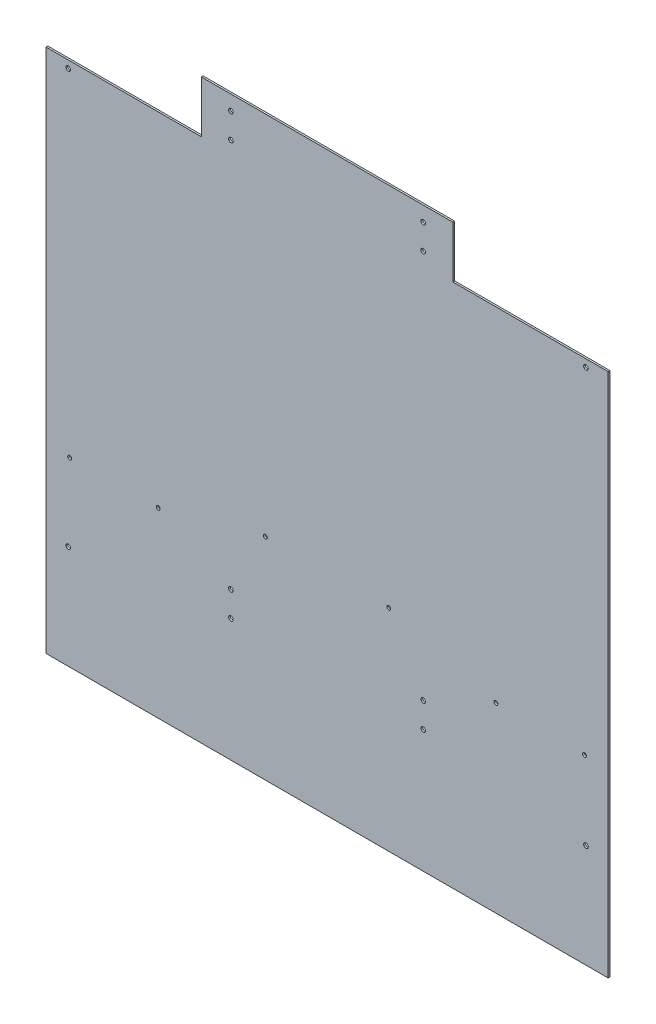
ISO-10303-21;
HEADER;
FILE_DESCRIPTION(('STEP AP214'),'2;1');
FILE_NAME('part.step','',(''),(''),'','','');
FILE_SCHEMA(('AUTOMOTIVE_DESIGN { 1 0 10303 214 1 1 1 1 }'));
ENDSEC;
DATA;
#1=APPLICATION_CONTEXT('core data for automotive mechanical design processes');
#2=APPLICATION_PROTOCOL_DEFINITION('international standard','automotive_design',2000,#1);
#3=PRODUCT_CONTEXT('',#1,'mechanical');
#4=PRODUCT('Part','Part','',(#3));
#5=PRODUCT_RELATED_PRODUCT_CATEGORY('part','',(#4));
#6=PRODUCT_DEFINITION_FORMATION('','',#4);
#7=PRODUCT_DEFINITION_CONTEXT('part definition',#1,'design');
#8=PRODUCT_DEFINITION('design','',#6,#7);
#9=PRODUCT_DEFINITION_SHAPE('','',#8);
#10=(LENGTH_UNIT() NAMED_UNIT(*) SI_UNIT(.MILLI.,.METRE.));
#11=(NAMED_UNIT(*) PLANE_ANGLE_UNIT() SI_UNIT($,.RADIAN.));
#12=(NAMED_UNIT(*) SI_UNIT($,.STERADIAN.) SOLID_ANGLE_UNIT());
#13=UNCERTAINTY_MEASURE_WITH_UNIT(LENGTH_MEASURE(1.E-05),#10,'distance_accuracy_value','');
#14=(GEOMETRIC_REPRESENTATION_CONTEXT(3) GLOBAL_UNCERTAINTY_ASSIGNED_CONTEXT((#13)) GLOBAL_UNIT_ASSIGNED_CONTEXT((#10,
#11,#12)) REPRESENTATION_CONTEXT('',''));
#15=CARTESIAN_POINT('',(0.,0.,0.));
#16=DIRECTION('',(0.,0.,1.));
#17=DIRECTION('',(1.,0.,0.));
#18=AXIS2_PLACEMENT_3D('',#15,#16,#17);
#19=CARTESIAN_POINT('',(0.,0.,0.));
#20=DIRECTION('',(0.,0.,-1.));
#21=DIRECTION('',(-1.,0.,0.));
#22=AXIS2_PLACEMENT_3D('',#19,#20,#21);
#23=PLANE('',#22);
#24=CARTESIAN_POINT('',(-165.1,922.02,0.));
#25=DIRECTION('',(0.,0.,1.));
#26=DIRECTION('',(1.,0.,0.));
#27=AXIS2_PLACEMENT_3D('',#24,#25,#26);
#28=CIRCLE('',#27,3.96874999999999);
#29=CARTESIAN_POINT('',(-161.13125,922.02,0.));
#30=VERTEX_POINT('',#29);
#31=EDGE_CURVE('E282',#30,#30,#28,.T.);
#32=ORIENTED_EDGE('',*,*,#31,.T.);
#33=EDGE_LOOP('',(#32));
#34=FACE_BOUND('',#33,.T.);
#35=CARTESIAN_POINT('',(-165.1,965.2,0.));
#36=DIRECTION('',(0.,0.,1.));
#37=DIRECTION('',(1.,0.,0.));
#38=AXIS2_PLACEMENT_3D('',#35,#36,#37);
#39=CIRCLE('',#38,3.96874999999999);
#40=CARTESIAN_POINT('',(-161.13125,965.2,0.));
#41=VERTEX_POINT('',#40);
#42=EDGE_CURVE('E276',#41,#41,#39,.T.);
#43=ORIENTED_EDGE('',*,*,#42,.T.);
#44=EDGE_LOOP('',(#43));
#45=FACE_BOUND('',#44,.T.);
#46=CARTESIAN_POINT('',(165.099999999979,965.2,0.));
#47=DIRECTION('',(0.,0.,1.));
#48=DIRECTION('',(1.,0.,0.));
#49=AXIS2_PLACEMENT_3D('',#46,#47,#48);
#50=CIRCLE('',#49,3.96874999999999);
#51=CARTESIAN_POINT('',(169.068749999979,965.2,0.));
#52=VERTEX_POINT('',#51);
#53=EDGE_CURVE('E270',#52,#52,#50,.T.);
#54=ORIENTED_EDGE('',*,*,#53,.T.);
#55=EDGE_LOOP('',(#54));
#56=FACE_BOUND('',#55,.T.);
#57=CARTESIAN_POINT('',(165.099999999979,922.02,0.));
#58=DIRECTION('',(0.,0.,1.));
#59=DIRECTION('',(1.,0.,0.));
#60=AXIS2_PLACEMENT_3D('',#57,#58,#59);
#61=CIRCLE('',#60,3.96874999999999);
#62=CARTESIAN_POINT('',(169.068749999979,922.02,0.));
#63=VERTEX_POINT('',#62);
#64=EDGE_CURVE('E264',#63,#63,#61,.T.);
#65=ORIENTED_EDGE('',*,*,#64,.T.);
#66=EDGE_LOOP('',(#65));
#67=FACE_BOUND('',#66,.T.);
#68=CARTESIAN_POINT('',(-165.099999999993,210.82,0.));
#69=DIRECTION('',(0.,0.,1.));
#70=DIRECTION('',(1.,0.,0.));
#71=AXIS2_PLACEMENT_3D('',#68,#69,#70);
#72=CIRCLE('',#71,3.96874999999999);
#73=CARTESIAN_POINT('',(-161.131249999993,210.82,0.));
#74=VERTEX_POINT('',#73);
#75=EDGE_CURVE('E258',#74,#74,#72,.T.);
#76=ORIENTED_EDGE('',*,*,#75,.T.);
#77=EDGE_LOOP('',(#76));
#78=FACE_BOUND('',#77,.T.);
#79=CARTESIAN_POINT('',(-165.099999999993,254.,0.));
#80=DIRECTION('',(0.,0.,1.));
#81=DIRECTION('',(1.,0.,0.));
#82=AXIS2_PLACEMENT_3D('',#79,#80,#81);
#83=CIRCLE('',#82,3.96874999999999);
#84=CARTESIAN_POINT('',(-161.131249999993,254.,0.));
#85=VERTEX_POINT('',#84);
#86=EDGE_CURVE('E252',#85,#85,#83,.T.);
#87=ORIENTED_EDGE('',*,*,#86,.T.);
#88=EDGE_LOOP('',(#87));
#89=FACE_BOUND('',#88,.T.);
#90=CARTESIAN_POINT('',(165.099999999987,254.,0.));
#91=DIRECTION('',(0.,0.,1.));
#92=DIRECTION('',(1.,0.,0.));
#93=AXIS2_PLACEMENT_3D('',#90,#91,#92);
#94=CIRCLE('',#93,3.96874999999999);
#95=CARTESIAN_POINT('',(169.068749999987,254.,0.));
#96=VERTEX_POINT('',#95);
#97=EDGE_CURVE('E246',#96,#96,#94,.T.);
#98=ORIENTED_EDGE('',*,*,#97,.T.);
#99=EDGE_LOOP('',(#98));
#100=FACE_BOUND('',#99,.T.);
#101=DIRECTION('',(0.,-1.,0.));
#102=VECTOR('',#101,1.);
#103=CARTESIAN_POINT('',(-482.6,0.,0.));
#104=LINE('',#103,#102);
#105=CARTESIAN_POINT('',(-482.6,901.7,0.));
#106=VERTEX_POINT('',#105);
#107=CARTESIAN_POINT('',(-482.6,0.,0.));
#108=VERTEX_POINT('',#107);
#109=EDGE_CURVE('E133',#106,#108,#104,.T.);
#110=ORIENTED_EDGE('',*,*,#109,.F.);
#111=DIRECTION('',(-1.,0.,0.));
#112=VECTOR('',#111,1.);
#113=CARTESIAN_POINT('',(-482.6,901.7,0.));
#114=LINE('',#113,#112);
#115=CARTESIAN_POINT('',(-215.9,901.7,0.));
#116=VERTEX_POINT('',#115);
#117=EDGE_CURVE('E87',#116,#106,#114,.T.);
#118=ORIENTED_EDGE('',*,*,#117,.F.);
#119=DIRECTION('',(0.,-1.,0.));
#120=VECTOR('',#119,1.);
#121=CARTESIAN_POINT('',(-215.9,901.7,0.));
#122=LINE('',#121,#120);
#123=CARTESIAN_POINT('',(-215.9,990.6,0.));
#124=VERTEX_POINT('',#123);
#125=EDGE_CURVE('E81',#124,#116,#122,.T.);
#126=ORIENTED_EDGE('',*,*,#125,.F.);
#127=DIRECTION('',(-1.,0.,0.));
#128=VECTOR('',#127,1.);
#129=CARTESIAN_POINT('',(-215.9,990.6,0.));
#130=LINE('',#129,#128);
#131=CARTESIAN_POINT('',(215.9,990.6,0.));
#132=VERTEX_POINT('',#131);
#133=EDGE_CURVE('E123',#132,#124,#130,.T.);
#134=ORIENTED_EDGE('',*,*,#133,.F.);
#135=DIRECTION('',(0.,1.,0.));
#136=VECTOR('',#135,1.);
#137=CARTESIAN_POINT('',(215.9,990.6,0.));
#138=LINE('',#137,#136);
#139=CARTESIAN_POINT('',(215.9,901.7,0.));
#140=VERTEX_POINT('',#139);
#141=EDGE_CURVE('E143',#140,#132,#138,.T.);
#142=ORIENTED_EDGE('',*,*,#141,.F.);
#143=DIRECTION('',(-1.,0.,0.));
#144=VECTOR('',#143,1.);
#145=CARTESIAN_POINT('',(215.9,901.7,0.));
#146=LINE('',#145,#144);
#147=CARTESIAN_POINT('',(482.6,901.7,0.));
#148=VERTEX_POINT('',#147);
#149=EDGE_CURVE('E141',#148,#140,#146,.T.);
#150=ORIENTED_EDGE('',*,*,#149,.F.);
#151=DIRECTION('',(0.,1.,0.));
#152=VECTOR('',#151,1.);
#153=CARTESIAN_POINT('',(482.6,0.,0.));
#154=LINE('',#153,#152);
#155=CARTESIAN_POINT('',(482.6,0.,0.));
#156=VERTEX_POINT('',#155);
#157=EDGE_CURVE('E139',#156,#148,#154,.T.);
#158=ORIENTED_EDGE('',*,*,#157,.F.);
#159=DIRECTION('',(1.,0.,0.));
#160=VECTOR('',#159,1.);
#161=CARTESIAN_POINT('',(-482.6,0.,0.));
#162=LINE('',#161,#160);
#163=EDGE_CURVE('E136',#108,#156,#162,.T.);
#164=ORIENTED_EDGE('',*,*,#163,.F.);
#165=EDGE_LOOP('',(#110,#118,#126,#134,#142,#150,#158,#164));
#166=FACE_BOUND('',#165,.T.);
#167=CARTESIAN_POINT('',(-441.96,311.509186149953,0.));
#168=DIRECTION('',(0.,0.,1.));
#169=DIRECTION('',(1.,0.,0.));
#170=AXIS2_PLACEMENT_3D('',#167,#168,#169);
#171=CIRCLE('',#170,3.3782);
#172=CARTESIAN_POINT('',(-438.5818,311.509186149953,0.));
#173=VERTEX_POINT('',#172);
#174=EDGE_CURVE('E137',#173,#173,#171,.T.);
#175=ORIENTED_EDGE('',*,*,#174,.T.);
#176=EDGE_LOOP('',(#175));
#177=FACE_BOUND('',#176,.T.);
#178=CARTESIAN_POINT('',(441.96,311.509186149953,0.));
#179=DIRECTION('',(0.,0.,1.));
#180=DIRECTION('',(1.,0.,0.));
#181=AXIS2_PLACEMENT_3D('',#178,#179,#180);
#182=CIRCLE('',#181,3.3782);
#183=CARTESIAN_POINT('',(445.3382,311.509186149953,0.));
#184=VERTEX_POINT('',#183);
#185=EDGE_CURVE('E186',#184,#184,#182,.T.);
#186=ORIENTED_EDGE('',*,*,#185,.T.);
#187=EDGE_LOOP('',(#186));
#188=FACE_BOUND('',#187,.T.);
#189=CARTESIAN_POINT('',(-105.907561141766,362.110143282902,0.));
#190=DIRECTION('',(0.,0.,1.));
#191=DIRECTION('',(1.,0.,0.));
#192=AXIS2_PLACEMENT_3D('',#189,#190,#191);
#193=CIRCLE('',#192,3.3782);
#194=CARTESIAN_POINT('',(-102.529361141766,362.110143282902,0.));
#195=VERTEX_POINT('',#194);
#196=EDGE_CURVE('E192',#195,#195,#193,.T.);
#197=ORIENTED_EDGE('',*,*,#196,.T.);
#198=EDGE_LOOP('',(#197));
#199=FACE_BOUND('',#198,.T.);
#200=CARTESIAN_POINT('',(-289.916431049834,312.805115190872,0.));
#201=DIRECTION('',(0.,0.,1.));
#202=DIRECTION('',(1.,0.,0.));
#203=AXIS2_PLACEMENT_3D('',#200,#201,#202);
#204=CIRCLE('',#203,3.3782);
#205=CARTESIAN_POINT('',(-286.538231049834,312.805115190872,0.));
#206=VERTEX_POINT('',#205);
#207=EDGE_CURVE('E198',#206,#206,#204,.T.);
#208=ORIENTED_EDGE('',*,*,#207,.T.);
#209=EDGE_LOOP('',(#208));
#210=FACE_BOUND('',#209,.T.);
#211=CARTESIAN_POINT('',(289.916431049834,312.805115190872,0.));
#212=DIRECTION('',(0.,0.,1.));
#213=DIRECTION('',(1.,0.,0.));
#214=AXIS2_PLACEMENT_3D('',#211,#212,#213);
#215=CIRCLE('',#214,3.3782);
#216=CARTESIAN_POINT('',(293.294631049834,312.805115190872,0.));
#217=VERTEX_POINT('',#216);
#218=EDGE_CURVE('E204',#217,#217,#215,.T.);
#219=ORIENTED_EDGE('',*,*,#218,.T.);
#220=EDGE_LOOP('',(#219));
#221=FACE_BOUND('',#220,.T.);
#222=CARTESIAN_POINT('',(105.907561141766,362.110143282902,0.));
#223=DIRECTION('',(0.,0.,1.));
#224=DIRECTION('',(1.,0.,0.));
#225=AXIS2_PLACEMENT_3D('',#222,#223,#224);
#226=CIRCLE('',#225,3.3782);
#227=CARTESIAN_POINT('',(109.285761141766,362.110143282902,0.));
#228=VERTEX_POINT('',#227);
#229=EDGE_CURVE('E210',#228,#228,#226,.T.);
#230=ORIENTED_EDGE('',*,*,#229,.T.);
#231=EDGE_LOOP('',(#230));
#232=FACE_BOUND('',#231,.T.);
#233=CARTESIAN_POINT('',(444.499999999977,889.,0.));
#234=DIRECTION('',(0.,0.,1.));
#235=DIRECTION('',(1.,0.,0.));
#236=AXIS2_PLACEMENT_3D('',#233,#234,#235);
#237=CIRCLE('',#236,3.96875000000002);
#238=CARTESIAN_POINT('',(448.468749999977,889.,0.));
#239=VERTEX_POINT('',#238);
#240=EDGE_CURVE('E216',#239,#239,#237,.T.);
#241=ORIENTED_EDGE('',*,*,#240,.T.);
#242=EDGE_LOOP('',(#241));
#243=FACE_BOUND('',#242,.T.);
#244=CARTESIAN_POINT('',(-444.500000000002,889.,0.));
#245=DIRECTION('',(0.,0.,1.));
#246=DIRECTION('',(1.,0.,0.));
#247=AXIS2_PLACEMENT_3D('',#244,#245,#246);
#248=CIRCLE('',#247,3.96875000000002);
#249=CARTESIAN_POINT('',(-440.531250000002,889.,0.));
#250=VERTEX_POINT('',#249);
#251=EDGE_CURVE('E222',#250,#250,#248,.T.);
#252=ORIENTED_EDGE('',*,*,#251,.T.);
#253=EDGE_LOOP('',(#252));
#254=FACE_BOUND('',#253,.T.);
#255=CARTESIAN_POINT('',(444.499999999979,177.8,0.));
#256=DIRECTION('',(0.,0.,1.));
#257=DIRECTION('',(1.,0.,0.));
#258=AXIS2_PLACEMENT_3D('',#255,#256,#257);
#259=CIRCLE('',#258,3.96875000000002);
#260=CARTESIAN_POINT('',(448.468749999979,177.8,0.));
#261=VERTEX_POINT('',#260);
#262=EDGE_CURVE('E228',#261,#261,#259,.T.);
#263=ORIENTED_EDGE('',*,*,#262,.T.);
#264=EDGE_LOOP('',(#263));
#265=FACE_BOUND('',#264,.T.);
#266=CARTESIAN_POINT('',(-444.5,177.8,0.));
#267=DIRECTION('',(0.,0.,1.));
#268=DIRECTION('',(1.,0.,0.));
#269=AXIS2_PLACEMENT_3D('',#266,#267,#268);
#270=CIRCLE('',#269,3.96875000000002);
#271=CARTESIAN_POINT('',(-440.53125,177.8,0.));
#272=VERTEX_POINT('',#271);
#273=EDGE_CURVE('E234',#272,#272,#270,.T.);
#274=ORIENTED_EDGE('',*,*,#273,.T.);
#275=EDGE_LOOP('',(#274));
#276=FACE_BOUND('',#275,.T.);
#277=CARTESIAN_POINT('',(165.099999999987,210.82,0.));
#278=DIRECTION('',(0.,0.,1.));
#279=DIRECTION('',(1.,0.,0.));
#280=AXIS2_PLACEMENT_3D('',#277,#278,#279);
#281=CIRCLE('',#280,3.96874999999999);
#282=CARTESIAN_POINT('',(169.068749999987,210.82,0.));
#283=VERTEX_POINT('',#282);
#284=EDGE_CURVE('E240',#283,#283,#281,.T.);
#285=ORIENTED_EDGE('',*,*,#284,.T.);
#286=EDGE_LOOP('',(#285));
#287=FACE_BOUND('',#286,.T.);
#288=ADVANCED_FACE('F35',(#34,#45,#56,#67,#78,#89,#100,#166,#177,#188,#199,#210,#221,#232,#243,
#254,#265,#276,#287),#23,.T.);
#289=CARTESIAN_POINT('',(0.,0.,3.175));
#290=DIRECTION('',(0.,0.,-1.));
#291=DIRECTION('',(-1.,0.,0.));
#292=AXIS2_PLACEMENT_3D('',#289,#290,#291);
#293=PLANE('',#292);
#294=CARTESIAN_POINT('',(-165.1,922.02,3.175));
#295=DIRECTION('',(0.,0.,1.));
#296=DIRECTION('',(1.,0.,0.));
#297=AXIS2_PLACEMENT_3D('',#294,#295,#296);
#298=CIRCLE('',#297,3.96874999999999);
#299=CARTESIAN_POINT('',(-161.13125,922.02,3.175));
#300=VERTEX_POINT('',#299);
#301=EDGE_CURVE('E285',#300,#300,#298,.T.);
#302=ORIENTED_EDGE('',*,*,#301,.F.);
#303=EDGE_LOOP('',(#302));
#304=FACE_BOUND('',#303,.T.);
#305=CARTESIAN_POINT('',(-165.1,965.2,3.175));
#306=DIRECTION('',(0.,0.,1.));
#307=DIRECTION('',(1.,0.,0.));
#308=AXIS2_PLACEMENT_3D('',#305,#306,#307);
#309=CIRCLE('',#308,3.96874999999999);
#310=CARTESIAN_POINT('',(-161.13125,965.2,3.175));
#311=VERTEX_POINT('',#310);
#312=EDGE_CURVE('E279',#311,#311,#309,.T.);
#313=ORIENTED_EDGE('',*,*,#312,.F.);
#314=EDGE_LOOP('',(#313));
#315=FACE_BOUND('',#314,.T.);
#316=CARTESIAN_POINT('',(165.099999999979,965.2,3.175));
#317=DIRECTION('',(0.,0.,1.));
#318=DIRECTION('',(1.,0.,0.));
#319=AXIS2_PLACEMENT_3D('',#316,#317,#318);
#320=CIRCLE('',#319,3.96874999999999);
#321=CARTESIAN_POINT('',(169.068749999979,965.2,3.175));
#322=VERTEX_POINT('',#321);
#323=EDGE_CURVE('E273',#322,#322,#320,.T.);
#324=ORIENTED_EDGE('',*,*,#323,.F.);
#325=EDGE_LOOP('',(#324));
#326=FACE_BOUND('',#325,.T.);
#327=CARTESIAN_POINT('',(165.099999999979,922.02,3.175));
#328=DIRECTION('',(0.,0.,1.));
#329=DIRECTION('',(1.,0.,0.));
#330=AXIS2_PLACEMENT_3D('',#327,#328,#329);
#331=CIRCLE('',#330,3.96874999999999);
#332=CARTESIAN_POINT('',(169.068749999979,922.02,3.175));
#333=VERTEX_POINT('',#332);
#334=EDGE_CURVE('E267',#333,#333,#331,.T.);
#335=ORIENTED_EDGE('',*,*,#334,.F.);
#336=EDGE_LOOP('',(#335));
#337=FACE_BOUND('',#336,.T.);
#338=CARTESIAN_POINT('',(-165.099999999993,210.82,3.175));
#339=DIRECTION('',(0.,0.,1.));
#340=DIRECTION('',(1.,0.,0.));
#341=AXIS2_PLACEMENT_3D('',#338,#339,#340);
#342=CIRCLE('',#341,3.96874999999999);
#343=CARTESIAN_POINT('',(-161.131249999993,210.82,3.175));
#344=VERTEX_POINT('',#343);
#345=EDGE_CURVE('E261',#344,#344,#342,.T.);
#346=ORIENTED_EDGE('',*,*,#345,.F.);
#347=EDGE_LOOP('',(#346));
#348=FACE_BOUND('',#347,.T.);
#349=CARTESIAN_POINT('',(-165.099999999993,254.,3.175));
#350=DIRECTION('',(0.,0.,1.));
#351=DIRECTION('',(1.,0.,0.));
#352=AXIS2_PLACEMENT_3D('',#349,#350,#351);
#353=CIRCLE('',#352,3.96874999999999);
#354=CARTESIAN_POINT('',(-161.131249999993,254.,3.175));
#355=VERTEX_POINT('',#354);
#356=EDGE_CURVE('E255',#355,#355,#353,.T.);
#357=ORIENTED_EDGE('',*,*,#356,.F.);
#358=EDGE_LOOP('',(#357));
#359=FACE_BOUND('',#358,.T.);
#360=CARTESIAN_POINT('',(165.099999999987,254.,3.175));
#361=DIRECTION('',(0.,0.,1.));
#362=DIRECTION('',(1.,0.,0.));
#363=AXIS2_PLACEMENT_3D('',#360,#361,#362);
#364=CIRCLE('',#363,3.96874999999999);
#365=CARTESIAN_POINT('',(169.068749999987,254.,3.175));
#366=VERTEX_POINT('',#365);
#367=EDGE_CURVE('E249',#366,#366,#364,.T.);
#368=ORIENTED_EDGE('',*,*,#367,.F.);
#369=EDGE_LOOP('',(#368));
#370=FACE_BOUND('',#369,.T.);
#371=CARTESIAN_POINT('',(165.099999999987,210.82,3.175));
#372=DIRECTION('',(0.,0.,1.));
#373=DIRECTION('',(1.,0.,0.));
#374=AXIS2_PLACEMENT_3D('',#371,#372,#373);
#375=CIRCLE('',#374,3.96874999999999);
#376=CARTESIAN_POINT('',(169.068749999987,210.82,3.175));
#377=VERTEX_POINT('',#376);
#378=EDGE_CURVE('E243',#377,#377,#375,.T.);
#379=ORIENTED_EDGE('',*,*,#378,.F.);
#380=EDGE_LOOP('',(#379));
#381=FACE_BOUND('',#380,.T.);
#382=CARTESIAN_POINT('',(-444.5,177.8,3.175));
#383=DIRECTION('',(0.,0.,1.));
#384=DIRECTION('',(1.,0.,0.));
#385=AXIS2_PLACEMENT_3D('',#382,#383,#384);
#386=CIRCLE('',#385,3.96875000000002);
#387=CARTESIAN_POINT('',(-440.53125,177.8,3.175));
#388=VERTEX_POINT('',#387);
#389=EDGE_CURVE('E237',#388,#388,#386,.T.);
#390=ORIENTED_EDGE('',*,*,#389,.F.);
#391=EDGE_LOOP('',(#390));
#392=FACE_BOUND('',#391,.T.);
#393=CARTESIAN_POINT('',(444.499999999979,177.8,3.175));
#394=DIRECTION('',(0.,0.,1.));
#395=DIRECTION('',(1.,0.,0.));
#396=AXIS2_PLACEMENT_3D('',#393,#394,#395);
#397=CIRCLE('',#396,3.96875000000002);
#398=CARTESIAN_POINT('',(448.468749999979,177.8,3.175));
#399=VERTEX_POINT('',#398);
#400=EDGE_CURVE('E231',#399,#399,#397,.T.);
#401=ORIENTED_EDGE('',*,*,#400,.F.);
#402=EDGE_LOOP('',(#401));
#403=FACE_BOUND('',#402,.T.);
#404=CARTESIAN_POINT('',(444.499999999977,889.,3.175));
#405=DIRECTION('',(0.,0.,1.));
#406=DIRECTION('',(1.,0.,0.));
#407=AXIS2_PLACEMENT_3D('',#404,#405,#406);
#408=CIRCLE('',#407,3.96875000000002);
#409=CARTESIAN_POINT('',(448.468749999977,889.,3.175));
#410=VERTEX_POINT('',#409);
#411=EDGE_CURVE('E219',#410,#410,#408,.T.);
#412=ORIENTED_EDGE('',*,*,#411,.F.);
#413=EDGE_LOOP('',(#412));
#414=FACE_BOUND('',#413,.T.);
#415=CARTESIAN_POINT('',(105.907561141766,362.110143282902,3.175));
#416=DIRECTION('',(0.,0.,1.));
#417=DIRECTION('',(1.,0.,0.));
#418=AXIS2_PLACEMENT_3D('',#415,#416,#417);
#419=CIRCLE('',#418,3.37819999999998);
#420=CARTESIAN_POINT('',(109.285761141766,362.110143282902,3.175));
#421=VERTEX_POINT('',#420);
#422=EDGE_CURVE('E213',#421,#421,#419,.T.);
#423=ORIENTED_EDGE('',*,*,#422,.F.);
#424=EDGE_LOOP('',(#423));
#425=FACE_BOUND('',#424,.T.);
#426=CARTESIAN_POINT('',(289.916431049834,312.805115190872,3.175));
#427=DIRECTION('',(0.,0.,1.));
#428=DIRECTION('',(1.,0.,0.));
#429=AXIS2_PLACEMENT_3D('',#426,#427,#428);
#430=CIRCLE('',#429,3.3782);
#431=CARTESIAN_POINT('',(293.294631049834,312.805115190872,3.175));
#432=VERTEX_POINT('',#431);
#433=EDGE_CURVE('E207',#432,#432,#430,.T.);
#434=ORIENTED_EDGE('',*,*,#433,.F.);
#435=EDGE_LOOP('',(#434));
#436=FACE_BOUND('',#435,.T.);
#437=CARTESIAN_POINT('',(-289.916431049834,312.805115190872,3.175));
#438=DIRECTION('',(0.,0.,1.));
#439=DIRECTION('',(1.,0.,0.));
#440=AXIS2_PLACEMENT_3D('',#437,#438,#439);
#441=CIRCLE('',#440,3.3782);
#442=CARTESIAN_POINT('',(-286.538231049834,312.805115190872,3.175));
#443=VERTEX_POINT('',#442);
#444=EDGE_CURVE('E201',#443,#443,#441,.T.);
#445=ORIENTED_EDGE('',*,*,#444,.F.);
#446=EDGE_LOOP('',(#445));
#447=FACE_BOUND('',#446,.T.);
#448=CARTESIAN_POINT('',(-105.907561141766,362.110143282902,3.175));
#449=DIRECTION('',(0.,0.,1.));
#450=DIRECTION('',(1.,0.,0.));
#451=AXIS2_PLACEMENT_3D('',#448,#449,#450);
#452=CIRCLE('',#451,3.37819999999998);
#453=CARTESIAN_POINT('',(-102.529361141766,362.110143282902,3.175));
#454=VERTEX_POINT('',#453);
#455=EDGE_CURVE('E195',#454,#454,#452,.T.);
#456=ORIENTED_EDGE('',*,*,#455,.F.);
#457=EDGE_LOOP('',(#456));
#458=FACE_BOUND('',#457,.T.);
#459=CARTESIAN_POINT('',(441.96,311.509186149953,3.175));
#460=DIRECTION('',(0.,0.,1.));
#461=DIRECTION('',(1.,0.,0.));
#462=AXIS2_PLACEMENT_3D('',#459,#460,#461);
#463=CIRCLE('',#462,3.3782);
#464=CARTESIAN_POINT('',(445.3382,311.509186149953,3.175));
#465=VERTEX_POINT('',#464);
#466=EDGE_CURVE('E189',#465,#465,#463,.T.);
#467=ORIENTED_EDGE('',*,*,#466,.F.);
#468=EDGE_LOOP('',(#467));
#469=FACE_BOUND('',#468,.T.);
#470=CARTESIAN_POINT('',(-441.96,311.509186149953,3.175));
#471=DIRECTION('',(0.,0.,1.));
#472=DIRECTION('',(1.,0.,0.));
#473=AXIS2_PLACEMENT_3D('',#470,#471,#472);
#474=CIRCLE('',#473,3.3782);
#475=CARTESIAN_POINT('',(-438.5818,311.509186149953,3.175));
#476=VERTEX_POINT('',#475);
#477=EDGE_CURVE('E183',#476,#476,#474,.T.);
#478=ORIENTED_EDGE('',*,*,#477,.F.);
#479=EDGE_LOOP('',(#478));
#480=FACE_BOUND('',#479,.T.);
#481=DIRECTION('',(0.,-1.,0.));
#482=VECTOR('',#481,1.);
#483=CARTESIAN_POINT('',(-482.6,0.,3.175));
#484=LINE('',#483,#482);
#485=CARTESIAN_POINT('',(-482.6,901.7,3.175));
#486=VERTEX_POINT('',#485);
#487=CARTESIAN_POINT('',(-482.6,0.,3.175));
#488=VERTEX_POINT('',#487);
#489=EDGE_CURVE('E148',#486,#488,#484,.T.);
#490=ORIENTED_EDGE('',*,*,#489,.T.);
#491=DIRECTION('',(1.,0.,0.));
#492=VECTOR('',#491,1.);
#493=CARTESIAN_POINT('',(-482.6,0.,3.175));
#494=LINE('',#493,#492);
#495=CARTESIAN_POINT('',(482.6,0.,3.175));
#496=VERTEX_POINT('',#495);
#497=EDGE_CURVE('E95',#488,#496,#494,.T.);
#498=ORIENTED_EDGE('',*,*,#497,.T.);
#499=DIRECTION('',(0.,1.,0.));
#500=VECTOR('',#499,1.);
#501=CARTESIAN_POINT('',(482.6,0.,3.175));
#502=LINE('',#501,#500);
#503=CARTESIAN_POINT('',(482.6,901.7,3.175));
#504=VERTEX_POINT('',#503);
#505=EDGE_CURVE('E163',#496,#504,#502,.T.);
#506=ORIENTED_EDGE('',*,*,#505,.T.);
#507=DIRECTION('',(-1.,0.,0.));
#508=VECTOR('',#507,1.);
#509=CARTESIAN_POINT('',(215.9,901.7,3.175));
#510=LINE('',#509,#508);
#511=CARTESIAN_POINT('',(215.9,901.7,3.175));
#512=VERTEX_POINT('',#511);
#513=EDGE_CURVE('E175',#504,#512,#510,.T.);
#514=ORIENTED_EDGE('',*,*,#513,.T.);
#515=DIRECTION('',(0.,1.,0.));
#516=VECTOR('',#515,1.);
#517=CARTESIAN_POINT('',(215.9,990.6,3.175));
#518=LINE('',#517,#516);
#519=CARTESIAN_POINT('',(215.9,990.6,3.175));
#520=VERTEX_POINT('',#519);
#521=EDGE_CURVE('E115',#512,#520,#518,.T.);
#522=ORIENTED_EDGE('',*,*,#521,.T.);
#523=DIRECTION('',(-1.,0.,0.));
#524=VECTOR('',#523,1.);
#525=CARTESIAN_POINT('',(-215.9,990.6,3.175));
#526=LINE('',#525,#524);
#527=CARTESIAN_POINT('',(-215.9,990.6,3.175));
#528=VERTEX_POINT('',#527);
#529=EDGE_CURVE('E108',#520,#528,#526,.T.);
#530=ORIENTED_EDGE('',*,*,#529,.T.);
#531=DIRECTION('',(0.,-1.,0.));
#532=VECTOR('',#531,1.);
#533=CARTESIAN_POINT('',(-215.9,901.7,3.175));
#534=LINE('',#533,#532);
#535=CARTESIAN_POINT('',(-215.9,901.7,3.175));
#536=VERTEX_POINT('',#535);
#537=EDGE_CURVE('E113',#528,#536,#534,.T.);
#538=ORIENTED_EDGE('',*,*,#537,.T.);
#539=DIRECTION('',(-1.,0.,0.));
#540=VECTOR('',#539,1.);
#541=CARTESIAN_POINT('',(-482.6,901.7,3.175));
#542=LINE('',#541,#540);
#543=EDGE_CURVE('E52',#536,#486,#542,.T.);
#544=ORIENTED_EDGE('',*,*,#543,.T.);
#545=EDGE_LOOP('',(#490,#498,#506,#514,#522,#530,#538,#544));
#546=FACE_BOUND('',#545,.T.);
#547=CARTESIAN_POINT('',(-444.500000000002,889.,3.175));
#548=DIRECTION('',(0.,0.,1.));
#549=DIRECTION('',(1.,0.,0.));
#550=AXIS2_PLACEMENT_3D('',#547,#548,#549);
#551=CIRCLE('',#550,3.96875000000002);
#552=CARTESIAN_POINT('',(-440.531250000002,889.,3.175));
#553=VERTEX_POINT('',#552);
#554=EDGE_CURVE('E225',#553,#553,#551,.T.);
#555=ORIENTED_EDGE('',*,*,#554,.F.);
#556=EDGE_LOOP('',(#555));
#557=FACE_BOUND('',#556,.T.);
#558=ADVANCED_FACE('F110',(#304,#315,#326,#337,#348,#359,#370,#381,#392,#403,#414,#425,#436,
#447,#458,#469,#480,#546,#557),#293,.F.);
#559=CARTESIAN_POINT('',(-482.6,0.,3.175));
#560=DIRECTION('',(1.,0.,0.));
#561=DIRECTION('',(0.,0.,-1.));
#562=AXIS2_PLACEMENT_3D('',#559,#560,#561);
#563=PLANE('',#562);
#564=ORIENTED_EDGE('',*,*,#109,.T.);
#565=DIRECTION('',(0.,0.,-1.));
#566=VECTOR('',#565,1.);
#567=CARTESIAN_POINT('',(-482.6,0.,3.175));
#568=LINE('',#567,#566);
#569=EDGE_CURVE('E11',#488,#108,#568,.T.);
#570=ORIENTED_EDGE('',*,*,#569,.F.);
#571=ORIENTED_EDGE('',*,*,#489,.F.);
#572=DIRECTION('',(0.,0.,-1.));
#573=VECTOR('',#572,1.);
#574=CARTESIAN_POINT('',(-482.6,901.7,3.175));
#575=LINE('',#574,#573);
#576=EDGE_CURVE('E129',#486,#106,#575,.T.);
#577=ORIENTED_EDGE('',*,*,#576,.T.);
#578=EDGE_LOOP('',(#564,#570,#571,#577));
#579=FACE_BOUND('',#578,.T.);
#580=ADVANCED_FACE('F37',(#579),#563,.F.);
#581=CARTESIAN_POINT('',(-482.6,0.,3.175));
#582=DIRECTION('',(0.,1.,0.));
#583=DIRECTION('',(0.,0.,1.));
#584=AXIS2_PLACEMENT_3D('',#581,#582,#583);
#585=PLANE('',#584);
#586=ORIENTED_EDGE('',*,*,#163,.T.);
#587=DIRECTION('',(0.,0.,-1.));
#588=VECTOR('',#587,1.);
#589=CARTESIAN_POINT('',(482.6,0.,3.175));
#590=LINE('',#589,#588);
#591=EDGE_CURVE('E44',#496,#156,#590,.T.);
#592=ORIENTED_EDGE('',*,*,#591,.F.);
#593=ORIENTED_EDGE('',*,*,#497,.F.);
#594=ORIENTED_EDGE('',*,*,#569,.T.);
#595=EDGE_LOOP('',(#586,#592,#593,#594));
#596=FACE_BOUND('',#595,.T.);
#597=ADVANCED_FACE('F357',(#596),#585,.F.);
#598=CARTESIAN_POINT('',(482.6,0.,3.175));
#599=DIRECTION('',(-1.,0.,0.));
#600=DIRECTION('',(0.,0.,1.));
#601=AXIS2_PLACEMENT_3D('',#598,#599,#600);
#602=PLANE('',#601);
#603=ORIENTED_EDGE('',*,*,#157,.T.);
#604=DIRECTION('',(0.,0.,-1.));
#605=VECTOR('',#604,1.);
#606=CARTESIAN_POINT('',(482.6,901.7,3.175));
#607=LINE('',#606,#605);
#608=EDGE_CURVE('E155',#504,#148,#607,.T.);
#609=ORIENTED_EDGE('',*,*,#608,.F.);
#610=ORIENTED_EDGE('',*,*,#505,.F.);
#611=ORIENTED_EDGE('',*,*,#591,.T.);
#612=EDGE_LOOP('',(#603,#609,#610,#611));
#613=FACE_BOUND('',#612,.T.);
#614=ADVANCED_FACE('F161',(#613),#602,.F.);
#615=CARTESIAN_POINT('',(215.9,901.7,3.175));
#616=DIRECTION('',(0.,-1.,0.));
#617=DIRECTION('',(0.,0.,-1.));
#618=AXIS2_PLACEMENT_3D('',#615,#616,#617);
#619=PLANE('',#618);
#620=ORIENTED_EDGE('',*,*,#149,.T.);
#621=DIRECTION('',(0.,0.,-1.));
#622=VECTOR('',#621,1.);
#623=CARTESIAN_POINT('',(215.9,901.7,3.175));
#624=LINE('',#623,#622);
#625=EDGE_CURVE('E152',#512,#140,#624,.T.);
#626=ORIENTED_EDGE('',*,*,#625,.F.);
#627=ORIENTED_EDGE('',*,*,#513,.F.);
#628=ORIENTED_EDGE('',*,*,#608,.T.);
#629=EDGE_LOOP('',(#620,#626,#627,#628));
#630=FACE_BOUND('',#629,.T.);
#631=ADVANCED_FACE('F171',(#630),#619,.F.);
#632=CARTESIAN_POINT('',(215.9,990.6,3.175));
#633=DIRECTION('',(-1.,0.,0.));
#634=DIRECTION('',(0.,0.,1.));
#635=AXIS2_PLACEMENT_3D('',#632,#633,#634);
#636=PLANE('',#635);
#637=ORIENTED_EDGE('',*,*,#141,.T.);
#638=DIRECTION('',(0.,0.,-1.));
#639=VECTOR('',#638,1.);
#640=CARTESIAN_POINT('',(215.9,990.6,3.175));
#641=LINE('',#640,#639);
#642=EDGE_CURVE('E124',#520,#132,#641,.T.);
#643=ORIENTED_EDGE('',*,*,#642,.F.);
#644=ORIENTED_EDGE('',*,*,#521,.F.);
#645=ORIENTED_EDGE('',*,*,#625,.T.);
#646=EDGE_LOOP('',(#637,#643,#644,#645));
#647=FACE_BOUND('',#646,.T.);
#648=ADVANCED_FACE('F174',(#647),#636,.F.);
#649=CARTESIAN_POINT('',(-215.9,990.6,3.175));
#650=DIRECTION('',(0.,-1.,0.));
#651=DIRECTION('',(0.,0.,-1.));
#652=AXIS2_PLACEMENT_3D('',#649,#650,#651);
#653=PLANE('',#652);
#654=ORIENTED_EDGE('',*,*,#133,.T.);
#655=DIRECTION('',(0.,0.,-1.));
#656=VECTOR('',#655,1.);
#657=CARTESIAN_POINT('',(-215.9,990.6,3.175));
#658=LINE('',#657,#656);
#659=EDGE_CURVE('E120',#528,#124,#658,.T.);
#660=ORIENTED_EDGE('',*,*,#659,.F.);
#661=ORIENTED_EDGE('',*,*,#529,.F.);
#662=ORIENTED_EDGE('',*,*,#642,.T.);
#663=EDGE_LOOP('',(#654,#660,#661,#662));
#664=FACE_BOUND('',#663,.T.);
#665=ADVANCED_FACE('F121',(#664),#653,.F.);
#666=CARTESIAN_POINT('',(-215.9,901.7,3.175));
#667=DIRECTION('',(1.,0.,0.));
#668=DIRECTION('',(0.,0.,-1.));
#669=AXIS2_PLACEMENT_3D('',#666,#667,#668);
#670=PLANE('',#669);
#671=ORIENTED_EDGE('',*,*,#125,.T.);
#672=DIRECTION('',(0.,0.,-1.));
#673=VECTOR('',#672,1.);
#674=CARTESIAN_POINT('',(-215.9,901.7,3.175));
#675=LINE('',#674,#673);
#676=EDGE_CURVE('E125',#536,#116,#675,.T.);
#677=ORIENTED_EDGE('',*,*,#676,.F.);
#678=ORIENTED_EDGE('',*,*,#537,.F.);
#679=ORIENTED_EDGE('',*,*,#659,.T.);
#680=EDGE_LOOP('',(#671,#677,#678,#679));
#681=FACE_BOUND('',#680,.T.);
#682=ADVANCED_FACE('F127',(#681),#670,.F.);
#683=CARTESIAN_POINT('',(-482.6,901.7,3.175));
#684=DIRECTION('',(0.,-1.,0.));
#685=DIRECTION('',(0.,0.,-1.));
#686=AXIS2_PLACEMENT_3D('',#683,#684,#685);
#687=PLANE('',#686);
#688=ORIENTED_EDGE('',*,*,#117,.T.);
#689=ORIENTED_EDGE('',*,*,#576,.F.);
#690=ORIENTED_EDGE('',*,*,#543,.F.);
#691=ORIENTED_EDGE('',*,*,#676,.T.);
#692=EDGE_LOOP('',(#688,#689,#690,#691));
#693=FACE_BOUND('',#692,.T.);
#694=ADVANCED_FACE('F329',(#693),#687,.F.);
#695=CARTESIAN_POINT('',(-441.96,311.509186149953,3.175));
#696=DIRECTION('',(0.,0.,1.));
#697=DIRECTION('',(1.,0.,0.));
#698=AXIS2_PLACEMENT_3D('',#695,#696,#697);
#699=CYLINDRICAL_SURFACE('',#698,3.3782);
#700=ORIENTED_EDGE('',*,*,#174,.F.);
#701=EDGE_LOOP('',(#700));
#702=FACE_BOUND('',#701,.T.);
#703=ORIENTED_EDGE('',*,*,#477,.T.);
#704=EDGE_LOOP('',(#703));
#705=FACE_BOUND('',#704,.T.);
#706=ADVANCED_FACE('F326',(#702,#705),#699,.F.);
#707=CARTESIAN_POINT('',(441.96,311.509186149953,3.175));
#708=DIRECTION('',(0.,0.,1.));
#709=DIRECTION('',(1.,0.,0.));
#710=AXIS2_PLACEMENT_3D('',#707,#708,#709);
#711=CYLINDRICAL_SURFACE('',#710,3.3782);
#712=ORIENTED_EDGE('',*,*,#185,.F.);
#713=EDGE_LOOP('',(#712));
#714=FACE_BOUND('',#713,.T.);
#715=ORIENTED_EDGE('',*,*,#466,.T.);
#716=EDGE_LOOP('',(#715));
#717=FACE_BOUND('',#716,.T.);
#718=ADVANCED_FACE('F328',(#714,#717),#711,.F.);
#719=CARTESIAN_POINT('',(-105.907561141766,362.110143282902,3.175));
#720=DIRECTION('',(0.,0.,1.));
#721=DIRECTION('',(1.,0.,0.));
#722=AXIS2_PLACEMENT_3D('',#719,#720,#721);
#723=CYLINDRICAL_SURFACE('',#722,3.37819999999999);
#724=ORIENTED_EDGE('',*,*,#196,.F.);
#725=EDGE_LOOP('',(#724));
#726=FACE_BOUND('',#725,.T.);
#727=ORIENTED_EDGE('',*,*,#455,.T.);
#728=EDGE_LOOP('',(#727));
#729=FACE_BOUND('',#728,.T.);
#730=ADVANCED_FACE('F336',(#726,#729),#723,.F.);
#731=CARTESIAN_POINT('',(-289.916431049834,312.805115190872,3.175));
#732=DIRECTION('',(0.,0.,1.));
#733=DIRECTION('',(1.,0.,0.));
#734=AXIS2_PLACEMENT_3D('',#731,#732,#733);
#735=CYLINDRICAL_SURFACE('',#734,3.3782);
#736=ORIENTED_EDGE('',*,*,#207,.F.);
#737=EDGE_LOOP('',(#736));
#738=FACE_BOUND('',#737,.T.);
#739=ORIENTED_EDGE('',*,*,#444,.T.);
#740=EDGE_LOOP('',(#739));
#741=FACE_BOUND('',#740,.T.);
#742=ADVANCED_FACE('F507',(#738,#741),#735,.F.);
#743=CARTESIAN_POINT('',(289.916431049834,312.805115190872,3.175));
#744=DIRECTION('',(0.,0.,1.));
#745=DIRECTION('',(1.,0.,0.));
#746=AXIS2_PLACEMENT_3D('',#743,#744,#745);
#747=CYLINDRICAL_SURFACE('',#746,3.3782);
#748=ORIENTED_EDGE('',*,*,#218,.F.);
#749=EDGE_LOOP('',(#748));
#750=FACE_BOUND('',#749,.T.);
#751=ORIENTED_EDGE('',*,*,#433,.T.);
#752=EDGE_LOOP('',(#751));
#753=FACE_BOUND('',#752,.T.);
#754=ADVANCED_FACE('F503',(#750,#753),#747,.F.);
#755=CARTESIAN_POINT('',(105.907561141766,362.110143282902,3.175));
#756=DIRECTION('',(0.,0.,1.));
#757=DIRECTION('',(1.,0.,0.));
#758=AXIS2_PLACEMENT_3D('',#755,#756,#757);
#759=CYLINDRICAL_SURFACE('',#758,3.37819999999999);
#760=ORIENTED_EDGE('',*,*,#229,.F.);
#761=EDGE_LOOP('',(#760));
#762=FACE_BOUND('',#761,.T.);
#763=ORIENTED_EDGE('',*,*,#422,.T.);
#764=EDGE_LOOP('',(#763));
#765=FACE_BOUND('',#764,.T.);
#766=ADVANCED_FACE('F386',(#762,#765),#759,.F.);
#767=CARTESIAN_POINT('',(444.499999999977,889.,3.175));
#768=DIRECTION('',(0.,0.,1.));
#769=DIRECTION('',(1.,0.,0.));
#770=AXIS2_PLACEMENT_3D('',#767,#768,#769);
#771=CYLINDRICAL_SURFACE('',#770,3.96875000000002);
#772=ORIENTED_EDGE('',*,*,#240,.F.);
#773=EDGE_LOOP('',(#772));
#774=FACE_BOUND('',#773,.T.);
#775=ORIENTED_EDGE('',*,*,#411,.T.);
#776=EDGE_LOOP('',(#775));
#777=FACE_BOUND('',#776,.T.);
#778=ADVANCED_FACE('F380',(#774,#777),#771,.F.);
#779=CARTESIAN_POINT('',(-444.500000000002,889.,3.175));
#780=DIRECTION('',(0.,0.,1.));
#781=DIRECTION('',(1.,0.,0.));
#782=AXIS2_PLACEMENT_3D('',#779,#780,#781);
#783=CYLINDRICAL_SURFACE('',#782,3.96875000000002);
#784=ORIENTED_EDGE('',*,*,#251,.F.);
#785=EDGE_LOOP('',(#784));
#786=FACE_BOUND('',#785,.T.);
#787=ORIENTED_EDGE('',*,*,#554,.T.);
#788=EDGE_LOOP('',(#787));
#789=FACE_BOUND('',#788,.T.);
#790=ADVANCED_FACE('F385',(#786,#789),#783,.F.);
#791=CARTESIAN_POINT('',(444.499999999979,177.8,3.175));
#792=DIRECTION('',(0.,0.,1.));
#793=DIRECTION('',(1.,0.,0.));
#794=AXIS2_PLACEMENT_3D('',#791,#792,#793);
#795=CYLINDRICAL_SURFACE('',#794,3.96875000000002);
#796=ORIENTED_EDGE('',*,*,#262,.F.);
#797=EDGE_LOOP('',(#796));
#798=FACE_BOUND('',#797,.T.);
#799=ORIENTED_EDGE('',*,*,#400,.T.);
#800=EDGE_LOOP('',(#799));
#801=FACE_BOUND('',#800,.T.);
#802=ADVANCED_FACE('F397',(#798,#801),#795,.F.);
#803=CARTESIAN_POINT('',(-444.5,177.8,3.175));
#804=DIRECTION('',(0.,0.,1.));
#805=DIRECTION('',(1.,0.,0.));
#806=AXIS2_PLACEMENT_3D('',#803,#804,#805);
#807=CYLINDRICAL_SURFACE('',#806,3.96875000000002);
#808=ORIENTED_EDGE('',*,*,#273,.F.);
#809=EDGE_LOOP('',(#808));
#810=FACE_BOUND('',#809,.T.);
#811=ORIENTED_EDGE('',*,*,#389,.T.);
#812=EDGE_LOOP('',(#811));
#813=FACE_BOUND('',#812,.T.);
#814=ADVANCED_FACE('F407',(#810,#813),#807,.F.);
#815=CARTESIAN_POINT('',(165.099999999987,210.82,3.175));
#816=DIRECTION('',(0.,0.,1.));
#817=DIRECTION('',(1.,0.,0.));
#818=AXIS2_PLACEMENT_3D('',#815,#816,#817);
#819=CYLINDRICAL_SURFACE('',#818,3.96874999999999);
#820=ORIENTED_EDGE('',*,*,#284,.F.);
#821=EDGE_LOOP('',(#820));
#822=FACE_BOUND('',#821,.T.);
#823=ORIENTED_EDGE('',*,*,#378,.T.);
#824=EDGE_LOOP('',(#823));
#825=FACE_BOUND('',#824,.T.);
#826=ADVANCED_FACE('F417',(#822,#825),#819,.F.);
#827=CARTESIAN_POINT('',(165.099999999987,254.,3.175));
#828=DIRECTION('',(0.,0.,1.));
#829=DIRECTION('',(1.,0.,0.));
#830=AXIS2_PLACEMENT_3D('',#827,#828,#829);
#831=CYLINDRICAL_SURFACE('',#830,3.96874999999999);
#832=ORIENTED_EDGE('',*,*,#97,.F.);
#833=EDGE_LOOP('',(#832));
#834=FACE_BOUND('',#833,.T.);
#835=ORIENTED_EDGE('',*,*,#367,.T.);
#836=EDGE_LOOP('',(#835));
#837=FACE_BOUND('',#836,.T.);
#838=ADVANCED_FACE('F427',(#834,#837),#831,.F.);
#839=CARTESIAN_POINT('',(-165.099999999993,254.,3.175));
#840=DIRECTION('',(0.,0.,1.));
#841=DIRECTION('',(1.,0.,0.));
#842=AXIS2_PLACEMENT_3D('',#839,#840,#841);
#843=CYLINDRICAL_SURFACE('',#842,3.96874999999999);
#844=ORIENTED_EDGE('',*,*,#86,.F.);
#845=EDGE_LOOP('',(#844));
#846=FACE_BOUND('',#845,.T.);
#847=ORIENTED_EDGE('',*,*,#356,.T.);
#848=EDGE_LOOP('',(#847));
#849=FACE_BOUND('',#848,.T.);
#850=ADVANCED_FACE('F437',(#846,#849),#843,.F.);
#851=CARTESIAN_POINT('',(-165.099999999993,210.82,3.175));
#852=DIRECTION('',(0.,0.,1.));
#853=DIRECTION('',(1.,0.,0.));
#854=AXIS2_PLACEMENT_3D('',#851,#852,#853);
#855=CYLINDRICAL_SURFACE('',#854,3.96874999999999);
#856=ORIENTED_EDGE('',*,*,#75,.F.);
#857=EDGE_LOOP('',(#856));
#858=FACE_BOUND('',#857,.T.);
#859=ORIENTED_EDGE('',*,*,#345,.T.);
#860=EDGE_LOOP('',(#859));
#861=FACE_BOUND('',#860,.T.);
#862=ADVANCED_FACE('F447',(#858,#861),#855,.F.);
#863=CARTESIAN_POINT('',(165.099999999979,922.02,3.175));
#864=DIRECTION('',(0.,0.,1.));
#865=DIRECTION('',(1.,0.,0.));
#866=AXIS2_PLACEMENT_3D('',#863,#864,#865);
#867=CYLINDRICAL_SURFACE('',#866,3.96874999999999);
#868=ORIENTED_EDGE('',*,*,#64,.F.);
#869=EDGE_LOOP('',(#868));
#870=FACE_BOUND('',#869,.T.);
#871=ORIENTED_EDGE('',*,*,#334,.T.);
#872=EDGE_LOOP('',(#871));
#873=FACE_BOUND('',#872,.T.);
#874=ADVANCED_FACE('F457',(#870,#873),#867,.F.);
#875=CARTESIAN_POINT('',(165.099999999979,965.2,3.175));
#876=DIRECTION('',(0.,0.,1.));
#877=DIRECTION('',(1.,0.,0.));
#878=AXIS2_PLACEMENT_3D('',#875,#876,#877);
#879=CYLINDRICAL_SURFACE('',#878,3.96874999999999);
#880=ORIENTED_EDGE('',*,*,#53,.F.);
#881=EDGE_LOOP('',(#880));
#882=FACE_BOUND('',#881,.T.);
#883=ORIENTED_EDGE('',*,*,#323,.T.);
#884=EDGE_LOOP('',(#883));
#885=FACE_BOUND('',#884,.T.);
#886=ADVANCED_FACE('F467',(#882,#885),#879,.F.);
#887=CARTESIAN_POINT('',(-165.1,965.2,3.175));
#888=DIRECTION('',(0.,0.,1.));
#889=DIRECTION('',(1.,0.,0.));
#890=AXIS2_PLACEMENT_3D('',#887,#888,#889);
#891=CYLINDRICAL_SURFACE('',#890,3.96874999999999);
#892=ORIENTED_EDGE('',*,*,#42,.F.);
#893=EDGE_LOOP('',(#892));
#894=FACE_BOUND('',#893,.T.);
#895=ORIENTED_EDGE('',*,*,#312,.T.);
#896=EDGE_LOOP('',(#895));
#897=FACE_BOUND('',#896,.T.);
#898=ADVANCED_FACE('F477',(#894,#897),#891,.F.);
#899=CARTESIAN_POINT('',(-165.1,922.02,3.175));
#900=DIRECTION('',(0.,0.,1.));
#901=DIRECTION('',(1.,0.,0.));
#902=AXIS2_PLACEMENT_3D('',#899,#900,#901);
#903=CYLINDRICAL_SURFACE('',#902,3.96874999999999);
#904=ORIENTED_EDGE('',*,*,#31,.F.);
#905=EDGE_LOOP('',(#904));
#906=FACE_BOUND('',#905,.T.);
#907=ORIENTED_EDGE('',*,*,#301,.T.);
#908=EDGE_LOOP('',(#907));
#909=FACE_BOUND('',#908,.T.);
#910=ADVANCED_FACE('F289',(#906,#909),#903,.F.);
#911=CLOSED_SHELL('',(#288,#558,#580,#597,#614,#631,#648,#665,#682,#694,#706,#718,#730,#742,
#754,#766,#778,#790,#802,#814,#826,#838,#850,#862,#874,#886,#898,#910));
#912=MANIFOLD_SOLID_BREP('B2',#911);
#913=ADVANCED_BREP_SHAPE_REPRESENTATION('',(#18,#912),#14);
#914=SHAPE_DEFINITION_REPRESENTATION(#9,#913);
ENDSEC;
END-ISO-10303-21;
